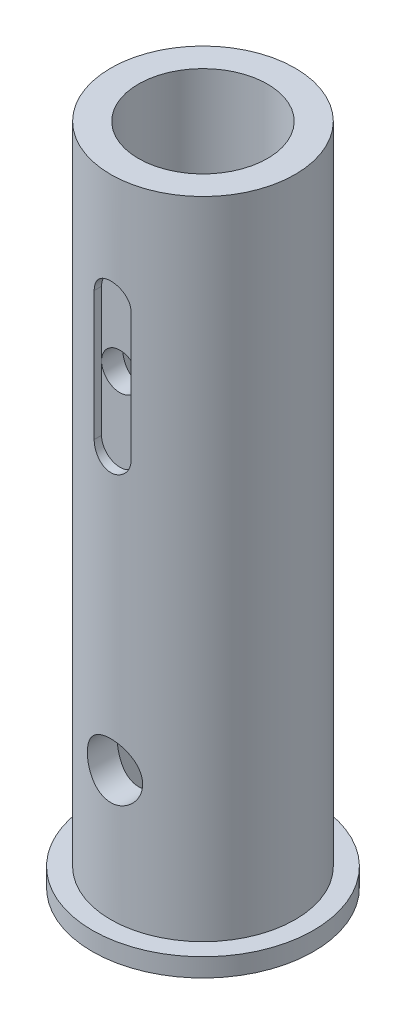
ISO-10303-21;
HEADER;
FILE_DESCRIPTION(('STEP AP214'),'2;1');
FILE_NAME('part.step','',(''),(''),'','','');
FILE_SCHEMA(('AUTOMOTIVE_DESIGN { 1 0 10303 214 1 1 1 1 }'));
ENDSEC;
DATA;
#1=APPLICATION_CONTEXT('core data for automotive mechanical design processes');
#2=APPLICATION_PROTOCOL_DEFINITION('international standard','automotive_design',2000,#1);
#3=PRODUCT_CONTEXT('',#1,'mechanical');
#4=PRODUCT('Part','Part','',(#3));
#5=PRODUCT_RELATED_PRODUCT_CATEGORY('part','',(#4));
#6=PRODUCT_DEFINITION_FORMATION('','',#4);
#7=PRODUCT_DEFINITION_CONTEXT('part definition',#1,'design');
#8=PRODUCT_DEFINITION('design','',#6,#7);
#9=PRODUCT_DEFINITION_SHAPE('','',#8);
#10=(LENGTH_UNIT() NAMED_UNIT(*) SI_UNIT(.MILLI.,.METRE.));
#11=(NAMED_UNIT(*) PLANE_ANGLE_UNIT() SI_UNIT($,.RADIAN.));
#12=(NAMED_UNIT(*) SI_UNIT($,.STERADIAN.) SOLID_ANGLE_UNIT());
#13=UNCERTAINTY_MEASURE_WITH_UNIT(LENGTH_MEASURE(1.E-05),#10,'distance_accuracy_value','');
#14=(GEOMETRIC_REPRESENTATION_CONTEXT(3) GLOBAL_UNCERTAINTY_ASSIGNED_CONTEXT((#13)) GLOBAL_UNIT_ASSIGNED_CONTEXT((#10,
#11,#12)) REPRESENTATION_CONTEXT('',''));
#15=CARTESIAN_POINT('',(0.,0.,0.));
#16=DIRECTION('',(0.,0.,1.));
#17=DIRECTION('',(1.,0.,0.));
#18=AXIS2_PLACEMENT_3D('',#15,#16,#17);
#19=CARTESIAN_POINT('',(0.,0.,9.));
#20=DIRECTION('',(0.,0.,1.));
#21=DIRECTION('',(1.,0.,0.));
#22=AXIS2_PLACEMENT_3D('',#19,#20,#21);
#23=PLANE('',#22);
#24=CARTESIAN_POINT('',(0.,51.,9.));
#25=DIRECTION('',(0.,0.,1.));
#26=DIRECTION('',(1.,0.,0.));
#27=AXIS2_PLACEMENT_3D('',#24,#25,#26);
#28=CIRCLE('',#27,2.);
#29=CARTESIAN_POINT('',(2.,51.,9.));
#30=VERTEX_POINT('',#29);
#31=CARTESIAN_POINT('',(-2.,51.,9.));
#32=VERTEX_POINT('',#31);
#33=EDGE_CURVE('E86',#30,#32,#28,.T.);
#34=ORIENTED_EDGE('',*,*,#33,.F.);
#35=DIRECTION('',(0.,1.,0.));
#36=VECTOR('',#35,1.);
#37=CARTESIAN_POINT('',(2.00000000000001,0.,9.));
#38=LINE('',#37,#36);
#39=CARTESIAN_POINT('',(2.,58.,9.));
#40=VERTEX_POINT('',#39);
#41=EDGE_CURVE('E126',#30,#40,#38,.T.);
#42=ORIENTED_EDGE('',*,*,#41,.T.);
#43=CARTESIAN_POINT('',(0.,58.,9.));
#44=DIRECTION('',(0.,0.,1.));
#45=DIRECTION('',(1.,0.,0.));
#46=AXIS2_PLACEMENT_3D('',#43,#44,#45);
#47=CIRCLE('',#46,2.);
#48=CARTESIAN_POINT('',(-2.00000000000001,58.,9.));
#49=VERTEX_POINT('',#48);
#50=EDGE_CURVE('E141',#40,#49,#47,.T.);
#51=ORIENTED_EDGE('',*,*,#50,.T.);
#52=DIRECTION('',(0.,1.,0.));
#53=VECTOR('',#52,1.);
#54=CARTESIAN_POINT('',(-1.99999999999999,0.,9.));
#55=LINE('',#54,#53);
#56=EDGE_CURVE('E94',#32,#49,#55,.T.);
#57=ORIENTED_EDGE('',*,*,#56,.F.);
#58=EDGE_LOOP('',(#34,#42,#51,#57));
#59=FACE_BOUND('',#58,.T.);
#60=ADVANCED_FACE('F65',(#59),#23,.T.);
#61=CARTESIAN_POINT('',(0.,-30.2842712474619,0.));
#62=DIRECTION('',(0.,1.,0.));
#63=DIRECTION('',(0.,0.,1.));
#64=AXIS2_PLACEMENT_3D('',#61,#62,#63);
#65=CYLINDRICAL_SURFACE('',#64,10.);
#66=CARTESIAN_POINT('',(0.,11.,10.));
#67=CARTESIAN_POINT('',(-0.1645772255066,11.0000019949698,9.999998585011));
#68=CARTESIAN_POINT('',(-0.329174636703059,11.0135877272479,9.99589831387907));
#69=CARTESIAN_POINT('',(-0.653576250609762,11.0674427084442,9.97994211187382));
#70=CARTESIAN_POINT('',(-0.81337900882284,11.1077199160467,9.96808386779384));
#71=CARTESIAN_POINT('',(-1.12346541550905,11.2134920338205,9.93791105003673));
#72=CARTESIAN_POINT('',(-1.27376272879074,11.2789497392379,9.91960600500851));
#73=CARTESIAN_POINT('',(-1.56124836210626,11.4330721861117,9.87844218475291));
#74=CARTESIAN_POINT('',(-1.69843493493934,11.5217400147908,9.85558280384133));
#75=CARTESIAN_POINT('',(-1.95974359436749,11.7224480149453,9.80701474385548));
#76=CARTESIAN_POINT('',(-2.08343614248868,11.8350332517718,9.78124767314073));
#77=CARTESIAN_POINT('',(-2.31049841846647,12.0792184598204,9.73011668420884));
#78=CARTESIAN_POINT('',(-2.41386472654882,12.2108216242499,9.70475283449003));
#79=CARTESIAN_POINT('',(-2.59960075447415,12.4929415060752,9.65668227987544));
#80=CARTESIAN_POINT('',(-2.68144618044427,12.6438169219815,9.63404813327749));
#81=CARTESIAN_POINT('',(-2.81842789549521,12.9579785084606,9.59487240788062));
#82=CARTESIAN_POINT('',(-2.87357059839947,13.121261687856,9.57832936626621));
#83=CARTESIAN_POINT('',(-2.95403267365303,13.4507805322609,9.55381741676868));
#84=CARTESIAN_POINT('',(-2.98014392469355,13.6168054877279,9.54562138649067));
#85=CARTESIAN_POINT('',(-3.00427461229344,13.9510663124335,9.53805579499534));
#86=CARTESIAN_POINT('',(-3.00230085522157,14.1193016361182,9.53868409521142));
#87=CARTESIAN_POINT('',(-2.97093954399623,14.446767817217,9.54849488135555));
#88=CARTESIAN_POINT('',(-2.9425441052537,14.6061045007245,9.55736777198281));
#89=CARTESIAN_POINT('',(-2.86074840854112,14.9176395725469,9.58216712457248));
#90=CARTESIAN_POINT('',(-2.80734568283282,15.0698372547487,9.59809428264701));
#91=CARTESIAN_POINT('',(-2.67632053307363,15.3652006993215,9.63545466149946));
#92=CARTESIAN_POINT('',(-2.59837633869285,15.5082141679105,9.65696032231904));
#93=CARTESIAN_POINT('',(-2.42070445177367,15.7794640440204,9.70301974000129));
#94=CARTESIAN_POINT('',(-2.32097148005177,15.9076968588276,9.72757423493982));
#95=CARTESIAN_POINT('',(-2.09762581531093,16.151372381524,9.77822022595875));
#96=CARTESIAN_POINT('',(-1.97318981493394,16.2660573280593,9.80433308620996));
#97=CARTESIAN_POINT('',(-1.70652651862793,16.4731079681285,9.85424488126517));
#98=CARTESIAN_POINT('',(-1.56429810372178,16.5654722568289,9.8780436703682));
#99=CARTESIAN_POINT('',(-1.26471007668561,16.7257198449295,9.92086320138941));
#100=CARTESIAN_POINT('',(-1.1072554994959,16.7934350324997,9.93985087336628));
#101=CARTESIAN_POINT('',(-0.782490831207039,16.9011991801993,9.97067043664444));
#102=CARTESIAN_POINT('',(-0.615183503179164,16.941255857065,9.98250432373999));
#103=CARTESIAN_POINT('',(-0.281904485336664,16.9913043557988,9.99736729287077));
#104=CARTESIAN_POINT('',(-0.116100195202374,17.0023231716032,10.0006970083558));
#105=CARTESIAN_POINT('',(0.214999211646766,16.9968616885758,9.99905846483519));
#106=CARTESIAN_POINT('',(0.380294393381561,16.9803850606971,9.99409131355514));
#107=CARTESIAN_POINT('',(0.701807210619393,16.921230777777,9.97661393974325));
#108=CARTESIAN_POINT('',(0.858145545228338,16.8791532248383,9.96427659598829));
#109=CARTESIAN_POINT('',(1.16150927790904,16.7707135344436,9.9334869568307));
#110=CARTESIAN_POINT('',(1.30853355405117,16.7043484779243,9.91503392642188));
#111=CARTESIAN_POINT('',(1.5928743789221,16.5474936690377,9.87339308702631));
#112=CARTESIAN_POINT('',(1.72988765239934,16.456481318104,9.8501056165928));
#113=CARTESIAN_POINT('',(1.9870466159603,16.2535504918944,9.80146937528705));
#114=CARTESIAN_POINT('',(2.10718806471188,16.1416267762247,9.7761200886242));
#115=CARTESIAN_POINT('',(2.33171489102052,15.8952253832613,9.72506343738007));
#116=CARTESIAN_POINT('',(2.43536962463001,15.7600762484564,9.69937650065513));
#117=CARTESIAN_POINT('',(2.61857990144313,15.4737441219731,9.65153030477949));
#118=CARTESIAN_POINT('',(2.69813607658965,15.3225615508843,9.62937095313121));
#119=CARTESIAN_POINT('',(2.83034694254316,15.00893501749,9.5913437922631));
#120=CARTESIAN_POINT('',(2.88312693874021,14.8465476269243,9.57544675673501));
#121=CARTESIAN_POINT('',(2.96043461630306,14.5146240621395,9.55183188739737));
#122=CARTESIAN_POINT('',(2.98497197957849,14.3450903584339,9.54411125069387));
#123=CARTESIAN_POINT('',(3.0044396896993,14.0112769632232,9.53799944941558));
#124=CARTESIAN_POINT('',(3.00056110615887,13.8470726979012,9.53923294700394));
#125=CARTESIAN_POINT('',(2.9661501088861,13.5217717931988,9.54998802392188));
#126=CARTESIAN_POINT('',(2.93561876249408,13.360675029639,9.55950927135902));
#127=CARTESIAN_POINT('',(2.84953777608686,13.0481092017367,9.58551527389243));
#128=CARTESIAN_POINT('',(2.79430351014248,12.8965454252826,9.60191209104934));
#129=CARTESIAN_POINT('',(2.66063014242147,12.6047151223586,9.63980557805265));
#130=CARTESIAN_POINT('',(2.58218659925722,12.4644507647169,9.6613032238508));
#131=CARTESIAN_POINT('',(2.40097527610175,12.1936737669475,9.70795352855338));
#132=CARTESIAN_POINT('',(2.29742552185996,12.0637024774796,9.7332108032858));
#133=CARTESIAN_POINT('',(2.07034869259555,11.8225950033838,9.78402640899066));
#134=CARTESIAN_POINT('',(1.94681643426898,11.7114637210644,9.80958481647543));
#135=CARTESIAN_POINT('',(1.67893152436652,11.5079531754101,9.85901873141573));
#136=CARTESIAN_POINT('',(1.53407577158122,11.4162171062891,9.88282319531422));
#137=CARTESIAN_POINT('',(1.23028274796705,11.2585296601919,9.92521360911553));
#138=CARTESIAN_POINT('',(1.07135210599791,11.192566223451,9.94380199862114));
#139=CARTESIAN_POINT('',(0.761515425310563,11.0942094486945,9.97204349938619));
#140=CARTESIAN_POINT('',(0.611573923908467,11.0589766542335,9.9824405476214));
#141=CARTESIAN_POINT('',(0.307760390461557,11.0118729495169,9.9964188898898));
#142=CARTESIAN_POINT('',(0.153889019716279,10.9999981345904,10.0000013230948));
#143=CARTESIAN_POINT('',(0.,11.,10.));
#144=B_SPLINE_CURVE_WITH_KNOTS('',3,(#66,#67,#68,#69,#70,#71,#72,#73,#74,#75,#76,#77,#78,#79,
#80,#81,#82,#83,#84,#85,#86,#87,#88,#89,#90,#91,#92,#93,#94,#95,#96,#97,#98,#99,#100,#101,#102,
#103,#104,#105,#106,#107,#108,#109,#110,#111,#112,#113,#114,#115,#116,#117,#118,#119,#120,#121,
#122,#123,#124,#125,#126,#127,#128,#129,#130,#131,#132,#133,#134,#135,#136,#137,#138,#139,#140,
#141,#142,#143),.UNSPECIFIED.,.T.,.F.,(4,2,2,2,2,2,2,2,2,2,2,2,2,2,2,2,2,2,2,2,2,2,2,2,2,2,2,2,
2,2,2,2,2,2,2,2,2,2,4),(0.,0.493166407225221,0.986479929691998,1.47906735260175,1.9717203288254,
2.47711205896383,2.98258874577266,3.49942962008218,4.01614629086447,4.51839378713198,
5.02051956638178,5.50452033395353,5.98856887316003,6.47924852894239,6.97004720317111,
7.48134208096333,7.99266913062143,8.50742093763377,9.02202907057615,9.5181761887709,
10.0142570710065,10.4991349336465,10.9840710918746,11.4802261140582,11.9765056400038,
12.4908080064564,13.0050968850536,13.516956299025,14.0286401892057,14.5190031093854,
15.0093463933232,15.4936008081456,15.9779479511534,16.4799385136898,16.9820594980413,
17.4988599232246,18.0154182319959,18.4766338387004,18.9377723390687),.UNSPECIFIED.);
#145=CARTESIAN_POINT('',(0.,11.,10.));
#146=VERTEX_POINT('',#145);
#147=EDGE_CURVE('E208',#146,#146,#144,.T.);
#148=ORIENTED_EDGE('',*,*,#147,.T.);
#149=EDGE_LOOP('',(#148));
#150=FACE_BOUND('',#149,.T.);
#151=CARTESIAN_POINT('',(0.,0.,0.));
#152=DIRECTION('',(0.,1.,0.));
#153=DIRECTION('',(0.,0.,1.));
#154=AXIS2_PLACEMENT_3D('',#151,#152,#153);
#155=CIRCLE('',#154,10.);
#156=CARTESIAN_POINT('',(0.,0.,10.));
#157=VERTEX_POINT('',#156);
#158=EDGE_CURVE('E223',#157,#157,#155,.T.);
#159=ORIENTED_EDGE('',*,*,#158,.T.);
#160=EDGE_LOOP('',(#159));
#161=FACE_BOUND('',#160,.T.);
#162=CARTESIAN_POINT('',(0.,70.,0.));
#163=DIRECTION('',(0.,1.,0.));
#164=DIRECTION('',(0.,0.,1.));
#165=AXIS2_PLACEMENT_3D('',#162,#163,#164);
#166=CIRCLE('',#165,10.);
#167=CARTESIAN_POINT('',(0.,70.,10.));
#168=VERTEX_POINT('',#167);
#169=EDGE_CURVE('E218',#168,#168,#166,.T.);
#170=ORIENTED_EDGE('',*,*,#169,.F.);
#171=EDGE_LOOP('',(#170));
#172=FACE_BOUND('',#171,.T.);
#173=CARTESIAN_POINT('',(-2.00000000000001,58.,9.79795897113271));
#174=CARTESIAN_POINT('',(-2.00000029709047,58.0556671372987,9.79795611157838));
#175=CARTESIAN_POINT('',(-1.99767440405642,58.1113070388049,9.79843398465431));
#176=CARTESIAN_POINT('',(-1.98839986829158,58.2221774356675,9.80032138150132));
#177=CARTESIAN_POINT('',(-1.98145179742019,58.2774079808152,9.80173079002197));
#178=CARTESIAN_POINT('',(-1.95376239954904,58.4417098803016,9.8073028328515));
#179=CARTESIAN_POINT('',(-1.92617555297559,58.5496628575345,9.81280956758554));
#180=CARTESIAN_POINT('',(-1.85359362042639,58.7592851934839,9.8267766040168));
#181=CARTESIAN_POINT('',(-1.80859661275257,58.8609538571135,9.83523723174864));
#182=CARTESIAN_POINT('',(-1.70250820881971,59.0553297677597,9.85415440257657));
#183=CARTESIAN_POINT('',(-1.64141514447462,59.1480360846177,9.86461115250626));
#184=CARTESIAN_POINT('',(-1.50396101869286,59.3231196733701,9.88650550448304));
#185=CARTESIAN_POINT('',(-1.42741780364327,59.4053525644588,9.89795377776164));
#186=CARTESIAN_POINT('',(-1.2616211819837,59.5559088785751,9.92044851228358));
#187=CARTESIAN_POINT('',(-1.17236580968336,59.624230146461,9.93149491105252));
#188=CARTESIAN_POINT('',(-0.982720106800593,59.7455778018475,9.95205620855081));
#189=CARTESIAN_POINT('',(-0.882239649549987,59.7984659384246,9.96155694564014));
#190=CARTESIAN_POINT('',(-0.673602404217799,59.8865517690996,9.97783510908995));
#191=CARTESIAN_POINT('',(-0.56544675429783,59.9217520799118,9.9846129382442));
#192=CARTESIAN_POINT('',(-0.346034817774205,59.9730140969379,9.99460635553984));
#193=CARTESIAN_POINT('',(-0.234838069151997,59.9893215789678,9.99786765043076));
#194=CARTESIAN_POINT('',(-0.011239753498265,60.0031019588768,10.0006184349224));
#195=CARTESIAN_POINT('',(0.101161724783845,60.0005762347569,10.000108200481));
#196=CARTESIAN_POINT('',(0.322284405513383,59.9769475992568,9.99540868887644));
#197=CARTESIAN_POINT('',(0.431035226714458,59.9561099001905,9.9912719366342));
#198=CARTESIAN_POINT('',(0.643464013108166,59.8968696460479,9.97984349003516));
#199=CARTESIAN_POINT('',(0.747141812282545,59.8584665165555,9.97255169250401));
#200=CARTESIAN_POINT('',(0.947240542625917,59.7649391930093,9.95554578241051));
#201=CARTESIAN_POINT('',(1.04361145363294,59.7097108261481,9.94581664782192));
#202=CARTESIAN_POINT('',(1.22581287576612,59.5841794594466,9.92500903258345));
#203=CARTESIAN_POINT('',(1.31164251244036,59.5138752103125,9.91393044014086));
#204=CARTESIAN_POINT('',(1.47189241307715,59.3587432767496,9.8914207473701));
#205=CARTESIAN_POINT('',(1.54608938999208,59.2736851958569,9.8799868648348));
#206=CARTESIAN_POINT('',(1.67922179979889,59.0921904830222,9.85823412232848));
#207=CARTESIAN_POINT('',(1.73815300484306,58.9957507096675,9.84791557170815));
#208=CARTESIAN_POINT('',(1.83915990928954,58.7938951901082,9.82955460084642));
#209=CARTESIAN_POINT('',(1.881189753269,58.6884559532069,9.8215183899669));
#210=CARTESIAN_POINT('',(1.94681419465982,58.4718827374886,9.80872322124987));
#211=CARTESIAN_POINT('',(1.97043625496866,58.3607575067037,9.80395938256574));
#212=CARTESIAN_POINT('',(1.98966587624393,58.2072863663071,9.80006354383926));
#213=CARTESIAN_POINT('',(1.99354251131102,58.1658917204351,9.79927519743986));
#214=CARTESIAN_POINT('',(1.9987063293293,58.0830042717252,9.79822334773544));
#215=CARTESIAN_POINT('',(1.99999784580931,58.0415117500884,9.79795896609649));
#216=CARTESIAN_POINT('',(2.,58.,9.79795897113271));
#217=B_SPLINE_CURVE_WITH_KNOTS('',3,(#173,#174,#175,#176,#177,#178,#179,#180,#181,#182,#183,
#184,#185,#186,#187,#188,#189,#190,#191,#192,#193,#194,#195,#196,#197,#198,#199,#200,#201,#202,
#203,#204,#205,#206,#207,#208,#209,#210,#211,#212,#213,#214,#215,#216),.UNSPECIFIED.,.F.,.F.,(4,
2,2,2,2,2,2,2,2,2,2,2,2,2,2,2,2,2,2,2,2,4),(0.,0.166897020715845,0.33377339664307,
0.666722601037227,0.999708566174145,1.33272905329864,1.66993288931439,2.00718892413592,
2.34737937755194,2.68751948879679,3.02318320738908,3.35882236614863,3.68967912555438,
4.02054670525121,4.35350597112352,4.68649283901808,5.02524540329293,5.3640916848566,
5.70385119298728,6.04310283225106,6.16778801087552,6.29226399953899),.UNSPECIFIED.);
#218=CARTESIAN_POINT('',(-2.00000000000001,58.,9.79795897113272));
#219=VERTEX_POINT('',#218);
#220=CARTESIAN_POINT('',(2.,58.,9.79795897113271));
#221=VERTEX_POINT('',#220);
#222=EDGE_CURVE('E169',#219,#221,#217,.T.);
#223=ORIENTED_EDGE('',*,*,#222,.T.);
#224=DIRECTION('',(0.,1.,0.));
#225=VECTOR('',#224,1.);
#226=CARTESIAN_POINT('',(2.00000000000002,-30.2842712474619,9.79795897113271));
#227=LINE('',#226,#225);
#228=CARTESIAN_POINT('',(2.,44.,9.79795897113271));
#229=VERTEX_POINT('',#228);
#230=EDGE_CURVE('E158',#221,#229,#227,.F.);
#231=ORIENTED_EDGE('',*,*,#230,.T.);
#232=CARTESIAN_POINT('',(2.,44.,9.79795897113271));
#233=CARTESIAN_POINT('',(2.00000029709046,43.9443328627013,9.79795611157838));
#234=CARTESIAN_POINT('',(1.99767440405642,43.8886929611951,9.79843398465431));
#235=CARTESIAN_POINT('',(1.98839986829158,43.7778225643325,9.80032138150132));
#236=CARTESIAN_POINT('',(1.98145179742019,43.7225920191848,9.80173079002197));
#237=CARTESIAN_POINT('',(1.95376239954904,43.5582901196984,9.8073028328515));
#238=CARTESIAN_POINT('',(1.92617555297558,43.4503371424655,9.81280956758554));
#239=CARTESIAN_POINT('',(1.85359362042639,43.2407148065161,9.8267766040168));
#240=CARTESIAN_POINT('',(1.80859661275257,43.1390461428865,9.83523723174864));
#241=CARTESIAN_POINT('',(1.7025082088197,42.9446702322403,9.85415440257657));
#242=CARTESIAN_POINT('',(1.64141514447461,42.8519639153823,9.86461115250626));
#243=CARTESIAN_POINT('',(1.50396101869285,42.6768803266299,9.88650550448304));
#244=CARTESIAN_POINT('',(1.42741780364326,42.5946474355412,9.89795377776164));
#245=CARTESIAN_POINT('',(1.26162118198369,42.4440911214249,9.92044851228358));
#246=CARTESIAN_POINT('',(1.17236580968336,42.375769853539,9.93149491105252));
#247=CARTESIAN_POINT('',(0.98272010680059,42.2544221981525,9.95205620855081));
#248=CARTESIAN_POINT('',(0.882239649549985,42.2015340615754,9.96155694564014));
#249=CARTESIAN_POINT('',(0.673602404217796,42.1134482309005,9.97783510908995));
#250=CARTESIAN_POINT('',(0.565446754297827,42.0782479200882,9.9846129382442));
#251=CARTESIAN_POINT('',(0.346034817774203,42.0269859030621,9.99460635553984));
#252=CARTESIAN_POINT('',(0.234838069151994,42.0106784210322,9.99786765043076));
#253=CARTESIAN_POINT('',(0.0112397534982624,41.9968980411232,10.0006184349224));
#254=CARTESIAN_POINT('',(-0.101161724783847,41.9994237652431,10.000108200481));
#255=CARTESIAN_POINT('',(-0.322284405513386,42.0230524007432,9.99540868887644));
#256=CARTESIAN_POINT('',(-0.431035226714462,42.0438900998095,9.9912719366342));
#257=CARTESIAN_POINT('',(-0.64346401310817,42.1031303539521,9.97984349003516));
#258=CARTESIAN_POINT('',(-0.747141812282548,42.1415334834445,9.97255169250401));
#259=CARTESIAN_POINT('',(-0.947240542625919,42.2350608069907,9.95554578241051));
#260=CARTESIAN_POINT('',(-1.04361145363294,42.2902891738519,9.94581664782193));
#261=CARTESIAN_POINT('',(-1.22581287576612,42.4158205405534,9.92500903258345));
#262=CARTESIAN_POINT('',(-1.31164251244036,42.4861247896875,9.91393044014086));
#263=CARTESIAN_POINT('',(-1.47189241307715,42.6412567232505,9.8914207473701));
#264=CARTESIAN_POINT('',(-1.54608938999209,42.7263148041431,9.8799868648348));
#265=CARTESIAN_POINT('',(-1.6792217997989,42.9078095169778,9.85823412232847));
#266=CARTESIAN_POINT('',(-1.73815300484306,43.0042492903325,9.84791557170815));
#267=CARTESIAN_POINT('',(-1.83915990928954,43.2061048098918,9.82955460084642));
#268=CARTESIAN_POINT('',(-1.881189753269,43.3115440467932,9.8215183899669));
#269=CARTESIAN_POINT('',(-1.94681419465983,43.5281172625114,9.80872322124987));
#270=CARTESIAN_POINT('',(-1.97043625496866,43.6392424932963,9.80395938256574));
#271=CARTESIAN_POINT('',(-1.98966587624394,43.7927136336929,9.80006354383926));
#272=CARTESIAN_POINT('',(-1.99354251131102,43.8341082795649,9.79927519743986));
#273=CARTESIAN_POINT('',(-1.9987063293293,43.9169957282749,9.79822334773544));
#274=CARTESIAN_POINT('',(-1.99999784580931,43.9584882499116,9.79795896609649));
#275=CARTESIAN_POINT('',(-2.,44.,9.79795897113271));
#276=B_SPLINE_CURVE_WITH_KNOTS('',3,(#232,#233,#234,#235,#236,#237,#238,#239,#240,#241,#242,
#243,#244,#245,#246,#247,#248,#249,#250,#251,#252,#253,#254,#255,#256,#257,#258,#259,#260,#261,
#262,#263,#264,#265,#266,#267,#268,#269,#270,#271,#272,#273,#274,#275),.UNSPECIFIED.,.F.,.F.,(4,
2,2,2,2,2,2,2,2,2,2,2,2,2,2,2,2,2,2,2,2,4),(0.,0.166897020715838,0.33377339664307,
0.666722601037227,0.999708566174145,1.33272905329864,1.66993288931439,2.00718892413592,
2.34737937755194,2.68751948879679,3.02318320738907,3.35882236614863,3.68967912555438,
4.02054670525121,4.35350597112352,4.68649283901808,5.02524540329293,5.3640916848566,
5.70385119298728,6.04310283225106,6.16778801087553,6.29226399953898),.UNSPECIFIED.);
#277=CARTESIAN_POINT('',(-2.,44.,9.79795897113271));
#278=VERTEX_POINT('',#277);
#279=EDGE_CURVE('E160',#229,#278,#276,.T.);
#280=ORIENTED_EDGE('',*,*,#279,.T.);
#281=DIRECTION('',(0.,1.,0.));
#282=VECTOR('',#281,1.);
#283=CARTESIAN_POINT('',(-1.99999999999999,-30.2842712474619,9.79795897113272));
#284=LINE('',#283,#282);
#285=EDGE_CURVE('E156',#219,#278,#284,.F.);
#286=ORIENTED_EDGE('',*,*,#285,.F.);
#287=EDGE_LOOP('',(#223,#231,#280,#286));
#288=FACE_BOUND('',#287,.T.);
#289=ADVANCED_FACE('F176',(#150,#161,#172,#288),#65,.T.);
#290=CARTESIAN_POINT('',(0.,-2.,0.));
#291=DIRECTION('',(0.,1.,0.));
#292=DIRECTION('',(0.,0.,1.));
#293=AXIS2_PLACEMENT_3D('',#290,#291,#292);
#294=CYLINDRICAL_SURFACE('',#293,7.);
#295=CARTESIAN_POINT('',(0.,49.,7.));
#296=CARTESIAN_POINT('',(0.109954902377251,49.0000019395619,6.99999869294341));
#297=CARTESIAN_POINT('',(0.219929747872581,49.0090977889761,6.99738417402043));
#298=CARTESIAN_POINT('',(0.436691991196988,49.0451642701023,6.98720905945103));
#299=CARTESIAN_POINT('',(0.543478166829615,49.0721416660741,6.97964659210084));
#300=CARTESIAN_POINT('',(0.750704300737872,49.1430080384165,6.96040691349073));
#301=CARTESIAN_POINT('',(0.851152880848227,49.1868734361519,6.94873544106341));
#302=CARTESIAN_POINT('',(1.04326876112927,49.2901779914784,6.92249978316544));
#303=CARTESIAN_POINT('',(1.13493514117817,49.3496187784904,6.90793529508022));
#304=CARTESIAN_POINT('',(1.30929444685895,49.4840350106729,6.8770473462558));
#305=CARTESIAN_POINT('',(1.39172372238095,49.5593447538553,6.8606904194519));
#306=CARTESIAN_POINT('',(1.54297135792436,49.7226477431377,6.82826734915641));
#307=CARTESIAN_POINT('',(1.61178767707783,49.8106428876322,6.81220124959343));
#308=CARTESIAN_POINT('',(1.73519790006431,49.9989935827909,6.78183014875388));
#309=CARTESIAN_POINT('',(1.78947821103349,50.0995619850649,6.76756702506017));
#310=CARTESIAN_POINT('',(1.88025170553981,50.3088720117508,6.74291343840667));
#311=CARTESIAN_POINT('',(1.91674871555719,50.4176118720709,6.73252214244871));
#312=CARTESIAN_POINT('',(1.96998433013875,50.6372347631655,6.71713608196016));
#313=CARTESIAN_POINT('',(1.9872055320285,50.7479913627678,6.71200978570011));
#314=CARTESIAN_POINT('',(2.00290667789185,50.9709311484461,6.70734208201995));
#315=CARTESIAN_POINT('',(2.00139069409621,51.0831140192502,6.70779946107611));
#316=CARTESIAN_POINT('',(1.98004134762903,51.3018686114562,6.71413034409934));
#317=CARTESIAN_POINT('',(1.96080325728392,51.4085043511808,6.71982782697936));
#318=CARTESIAN_POINT('',(1.9055138608579,51.6169672196276,6.7357134838281));
#319=CARTESIAN_POINT('',(1.8694610348125,51.7187939127205,6.74590206376403));
#320=CARTESIAN_POINT('',(1.78110681137812,51.9162462444318,6.7697686351608));
#321=CARTESIAN_POINT('',(1.72860551172881,52.0117770724017,6.78348916405649));
#322=CARTESIAN_POINT('',(1.60898379167885,52.1928765612134,6.81285216882059));
#323=CARTESIAN_POINT('',(1.54186011673345,52.2784429977349,6.82849507221912));
#324=CARTESIAN_POINT('',(1.39190399673021,52.4405723756064,6.86066250656356));
#325=CARTESIAN_POINT('',(1.30857487484533,52.5166744759672,6.87719804572366));
#326=CARTESIAN_POINT('',(1.13013228238623,52.6539260036403,6.90876247218345));
#327=CARTESIAN_POINT('',(1.03501820148189,52.7150746560417,6.92379128137825));
#328=CARTESIAN_POINT('',(0.834923073091447,52.820928734774,6.95076528065502));
#329=CARTESIAN_POINT('',(0.729889817810006,52.8655402868042,6.96269275497229));
#330=CARTESIAN_POINT('',(0.513393229967469,52.9363338914168,6.98199251487585));
#331=CARTESIAN_POINT('',(0.401931525810145,52.9625205892453,6.98936594856255));
#332=CARTESIAN_POINT('',(0.179666388644348,52.9949732857095,6.99854874514672));
#333=CARTESIAN_POINT('',(0.0689613468605068,53.001864695373,7.00053272850599));
#334=CARTESIAN_POINT('',(-0.152026526805584,52.997272733699,6.99922084707091));
#335=CARTESIAN_POINT('',(-0.262309407757108,52.9857915671541,6.99592561580629));
#336=CARTESIAN_POINT('',(-0.477018633430315,52.9452895556838,6.98453926685206));
#337=CARTESIAN_POINT('',(-0.581518211734844,52.9166268186766,6.97654613017679));
#338=CARTESIAN_POINT('',(-0.784208686205642,52.8429994980153,6.95667998741883));
#339=CARTESIAN_POINT('',(-0.882398851248718,52.7980330291107,6.94480653265874));
#340=CARTESIAN_POINT('',(-1.07204168512003,52.6919766633549,6.91809961169145));
#341=CARTESIAN_POINT('',(-1.16330248654009,52.6305588011747,6.9032076317834));
#342=CARTESIAN_POINT('',(-1.33443852805947,52.4937474940489,6.87217947098441));
#343=CARTESIAN_POINT('',(-1.41431117084304,52.4183508699354,6.85604300755107));
#344=CARTESIAN_POINT('',(-1.56310642834007,52.2527906579506,6.82368619629443));
#345=CARTESIAN_POINT('',(-1.63158542740713,52.162224724441,6.80748036858305));
#346=CARTESIAN_POINT('',(-1.75239531606757,51.9705374113753,6.77738894734787));
#347=CARTESIAN_POINT('',(-1.8047267674867,51.8694163992287,6.76350327310608));
#348=CARTESIAN_POINT('',(-1.89137454118279,51.6599087890248,6.73978651242835));
#349=CARTESIAN_POINT('',(-1.92578633239654,51.5515642365024,6.72993400029434));
#350=CARTESIAN_POINT('',(-1.9757945006787,51.3302900644252,6.71542456669526));
#351=CARTESIAN_POINT('',(-1.99139657901587,51.2173618449236,6.71076607094366));
#352=CARTESIAN_POINT('',(-2.00298024246851,50.9947039670632,6.70731703127619));
#353=CARTESIAN_POINT('',(-1.99968027644405,50.8850144954434,6.70831160808103));
#354=CARTESIAN_POINT('',(-1.97524710957467,50.6678252693383,6.71554597206102));
#355=CARTESIAN_POINT('',(-1.95411450379874,50.5603254419081,6.72178558421113));
#356=CARTESIAN_POINT('',(-1.89505968816675,50.3516216288314,6.73866977160527));
#357=CARTESIAN_POINT('',(-1.85731091786365,50.2503646129888,6.74926877048974));
#358=CARTESIAN_POINT('',(-1.76622949301581,50.0555412655078,6.77367302842112));
#359=CARTESIAN_POINT('',(-1.71289408043152,49.9619762987268,6.78747885482392));
#360=CARTESIAN_POINT('',(-1.59006546534829,49.7818164781947,6.81731668949934));
#361=CARTESIAN_POINT('',(-1.52009227722732,49.695558608658,6.83340763179064));
#362=CARTESIAN_POINT('',(-1.36685984037935,49.5357761041902,6.86569845092232));
#363=CARTESIAN_POINT('',(-1.28359725072856,49.4622546808892,6.88189835417168));
#364=CARTESIAN_POINT('',(-1.10357432086539,49.3281628156734,6.91307959572365));
#365=CARTESIAN_POINT('',(-1.00652250235978,49.2679730127304,6.92801901037413));
#366=CARTESIAN_POINT('',(-0.803250529646662,49.164854214978,6.95451395777971));
#367=CARTESIAN_POINT('',(-0.69703542411474,49.1219157880669,6.96607133870287));
#368=CARTESIAN_POINT('',(-0.492916315335036,49.0591524486046,6.98327344725308));
#369=CARTESIAN_POINT('',(-0.395763007624392,49.0370264633154,6.98949684362076));
#370=CARTESIAN_POINT('',(-0.199078368786369,49.0074503427579,6.99786043852147));
#371=CARTESIAN_POINT('',(-0.0995473576160926,48.9999982440231,7.00000118333996));
#372=CARTESIAN_POINT('',(0.,49.,7.));
#373=B_SPLINE_CURVE_WITH_KNOTS('',3,(#295,#296,#297,#298,#299,#300,#301,#302,#303,#304,#305,
#306,#307,#308,#309,#310,#311,#312,#313,#314,#315,#316,#317,#318,#319,#320,#321,#322,#323,#324,
#325,#326,#327,#328,#329,#330,#331,#332,#333,#334,#335,#336,#337,#338,#339,#340,#341,#342,#343,
#344,#345,#346,#347,#348,#349,#350,#351,#352,#353,#354,#355,#356,#357,#358,#359,#360,#361,#362,
#363,#364,#365,#366,#367,#368,#369,#370,#371,#372),.UNSPECIFIED.,.T.,.F.,(4,2,2,2,2,2,2,2,2,2,2,
2,2,2,2,2,2,2,2,2,2,2,2,2,2,2,2,2,2,2,2,2,2,2,2,2,2,2,4),(0.,0.329499312542343,
0.659123339795181,0.988288812895347,1.31748873543516,1.65447811530783,1.99151797873714,
2.33533075300058,2.6790695154481,3.0139950986275,3.34884789231233,3.67284785829333,
3.99687711786126,4.32500803291211,4.65321205577344,4.99378500602502,5.33437560155449,
5.67687101104449,6.01928004014613,6.35045457698201,6.68158937434649,7.0060514047952,
7.3305509657553,7.66207525344452,7.99367503187788,8.33612104884334,8.67855514965299,
9.01914573366139,9.35963305787734,9.68726681616471,10.0148896418598,10.3391709629126,
10.6635096999758,10.9986765689036,11.3339278310847,11.6777797897016,12.0214434923409,
12.3197946803795,12.6181059442772),.UNSPECIFIED.);
#374=CARTESIAN_POINT('',(0.,49.,7.));
#375=VERTEX_POINT('',#374);
#376=EDGE_CURVE('E69',#375,#375,#373,.T.);
#377=ORIENTED_EDGE('',*,*,#376,.T.);
#378=EDGE_LOOP('',(#377));
#379=FACE_BOUND('',#378,.T.);
#380=CARTESIAN_POINT('',(0.,11.,7.));
#381=CARTESIAN_POINT('',(-0.160281740269092,11.0000074695815,6.9999940839629));
#382=CARTESIAN_POINT('',(-0.32083390752243,11.0129213160966,6.99443250051265));
#383=CARTESIAN_POINT('',(-0.637349314958985,11.0640823654265,6.97273920628719));
#384=CARTESIAN_POINT('',(-0.793299928144206,11.1023935290734,6.95658080950724));
#385=CARTESIAN_POINT('',(-1.09553470514829,11.2026697636251,6.91541630739346));
#386=CARTESIAN_POINT('',(-1.24185033642246,11.2645528438054,6.89044089228941));
#387=CARTESIAN_POINT('',(-1.5218733278968,11.4098644185637,6.83405660276648));
#388=CARTESIAN_POINT('',(-1.6555840905338,11.4932870760918,6.80264947176647));
#389=CARTESIAN_POINT('',(-1.91384144205638,11.6839276476879,6.7346782187555));
#390=CARTESIAN_POINT('',(-2.03764045493602,11.7920952598958,6.69793895962371));
#391=CARTESIAN_POINT('',(-2.26599040232609,12.0271438685008,6.62417654338771));
#392=CARTESIAN_POINT('',(-2.3705306503261,12.1540351846027,6.5871532404671));
#393=CARTESIAN_POINT('',(-2.56285686126492,12.4310327227155,6.51482055271223));
#394=CARTESIAN_POINT('',(-2.64946811752636,12.5820104580293,6.47970460244924));
#395=CARTESIAN_POINT('',(-2.79573199408101,12.898109428189,6.41796168635027));
#396=CARTESIAN_POINT('',(-2.8553992914263,13.0632229044862,6.39133010120133));
#397=CARTESIAN_POINT('',(-2.94294919918374,13.3943007383092,6.35147799087276));
#398=CARTESIAN_POINT('',(-2.97227494401776,13.5598077017795,6.3376522143554));
#399=CARTESIAN_POINT('',(-3.00280607158394,13.8939259696104,6.32324849688131));
#400=CARTESIAN_POINT('',(-3.00402828615096,14.0625353552914,6.32266262625149));
#401=CARTESIAN_POINT('',(-2.97939999510613,14.3832999037186,6.33429573902539));
#402=CARTESIAN_POINT('',(-2.95576113815072,14.535670623332,6.34546870930158));
#403=CARTESIAN_POINT('',(-2.88580772808799,14.8340275859013,6.37758411517576));
#404=CARTESIAN_POINT('',(-2.83948852833539,14.9800125138861,6.39852855266591));
#405=CARTESIAN_POINT('',(-2.7245765907069,15.2652471514352,6.44830685655465));
#406=CARTESIAN_POINT('',(-2.65551974428426,15.4042802942182,6.47730295111391));
#407=CARTESIAN_POINT('',(-2.49742304873013,15.6693463240694,6.53988493882129));
#408=CARTESIAN_POINT('',(-2.40837507480489,15.7953738949295,6.57347269593628));
#409=CARTESIAN_POINT('',(-2.20343405392229,16.0427775036214,6.64512404535213));
#410=CARTESIAN_POINT('',(-2.08584728856133,16.162716729472,6.68331855389209));
#411=CARTESIAN_POINT('',(-1.83187332405076,16.381671590656,6.75734605758523));
#412=CARTESIAN_POINT('',(-1.6954812162799,16.4806817458782,6.79317843254652));
#413=CARTESIAN_POINT('',(-1.40318582301271,16.657243932807,6.8595969368957));
#414=CARTESIAN_POINT('',(-1.24687114970231,16.7341790187056,6.89002455033727));
#415=CARTESIAN_POINT('',(-0.921879694158933,16.8601502376147,6.94097396260558));
#416=CARTESIAN_POINT('',(-0.753210215657664,16.9092027059777,6.96150156039981));
#417=CARTESIAN_POINT('',(-0.420276238941369,16.974933860459,6.98923526893385));
#418=CARTESIAN_POINT('',(-0.256457961010923,16.9935387653144,6.99723249964589));
#419=CARTESIAN_POINT('',(0.0721433011185079,17.0036295764082,7.00155416651738));
#420=CARTESIAN_POINT('',(0.236925971900557,16.9951238525324,6.99788220531666));
#421=CARTESIAN_POINT('',(0.553542439626672,16.9525843679452,6.9797867632015));
#422=CARTESIAN_POINT('',(0.705598931504218,16.9199316785517,6.96594519473644));
#423=CARTESIAN_POINT('',(1.00189113639242,16.8319791057618,6.92953888009974));
#424=CARTESIAN_POINT('',(1.14612587370002,16.7766764042778,6.90697304848521));
#425=CARTESIAN_POINT('',(1.42777696523888,16.6431988404979,6.8543875151372));
#426=CARTESIAN_POINT('',(1.56483974951837,16.5643636697739,6.82415705388474));
#427=CARTESIAN_POINT('',(1.82428490564705,16.3867810555241,6.75942988391438));
#428=CARTESIAN_POINT('',(1.94666097512992,16.2880251119767,6.72493135648758));
#429=CARTESIAN_POINT('',(2.18296759532595,16.0647104121571,6.65214788697903));
#430=CARTESIAN_POINT('',(2.29556617553686,15.9387677899386,6.61377354998591));
#431=CARTESIAN_POINT('',(2.49843431443676,15.6692177013684,6.53984037690252));
#432=CARTESIAN_POINT('',(2.58869766421195,15.5256053396252,6.50428232556792));
#433=CARTESIAN_POINT('',(2.74563875632303,15.2211861470414,6.43962969285319));
#434=CARTESIAN_POINT('',(2.81186415020233,15.06011699095,6.41066255987443));
#435=CARTESIAN_POINT('',(2.91565885028324,14.7274736732605,6.36413607530145));
#436=CARTESIAN_POINT('',(2.95325364225748,14.5559090016754,6.346566580073));
#437=CARTESIAN_POINT('',(2.9961194841997,14.2220088276671,6.32643481136621));
#438=CARTESIAN_POINT('',(3.00374693238451,14.0600407324894,6.3227792566546));
#439=CARTESIAN_POINT('',(2.99282649265778,13.7372102530885,6.32795618271386));
#440=CARTESIAN_POINT('',(2.97428322126543,13.5763476788807,6.33678646098226));
#441=CARTESIAN_POINT('',(2.91356431394149,13.2689583037266,6.3649165389077));
#442=CARTESIAN_POINT('',(2.87266975661121,13.1221212084293,6.38364713099396));
#443=CARTESIAN_POINT('',(2.769702223632,12.8373792339161,6.42898875831973));
#444=CARTESIAN_POINT('',(2.70762322652258,12.6994769075923,6.45560203384715));
#445=CARTESIAN_POINT('',(2.55963250501149,12.4271792913205,6.5157524732596));
#446=CARTESIAN_POINT('',(2.47248232196069,12.2935308463052,6.5496164957701));
#447=CARTESIAN_POINT('',(2.2784960092513,12.0420176387525,6.61959778926566));
#448=CARTESIAN_POINT('',(2.17165243666714,11.9241588729508,6.6557159087398));
#449=CARTESIAN_POINT('',(1.93135048700133,11.6979963644993,6.72955424641834));
#450=CARTESIAN_POINT('',(1.79645724733279,11.5911804344272,6.76717599448736));
#451=CARTESIAN_POINT('',(1.50919760355001,11.4015602399688,6.83696477009089));
#452=CARTESIAN_POINT('',(1.35682332068822,11.3187668624002,6.86912932173673));
#453=CARTESIAN_POINT('',(1.11954532843042,11.2154073090105,6.91035442086788));
#454=CARTESIAN_POINT('',(1.03957288024831,11.1845667091982,6.92286397965452));
#455=CARTESIAN_POINT('',(0.876970802782696,11.1297617979777,6.94533202163241));
#456=CARTESIAN_POINT('',(0.794342461515165,11.1057942077247,6.95529172101821));
#457=CARTESIAN_POINT('',(0.627265567421394,11.0650522827166,6.97234378079151));
#458=CARTESIAN_POINT('',(0.542821986677283,11.0482604156195,6.97944312738119));
#459=CARTESIAN_POINT('',(0.372647906839312,11.0219912857966,6.99059319635283));
#460=CARTESIAN_POINT('',(0.286918376030204,11.0125087759861,6.99464610559385));
#461=CARTESIAN_POINT('',(0.167492669563776,11.0044917250564,6.99807592564235));
#462=CARTESIAN_POINT('',(0.134021137958666,11.0028081458824,6.99879677015532));
#463=CARTESIAN_POINT('',(0.0670370145842115,11.0005614987159,6.99975942751561));
#464=CARTESIAN_POINT('',(0.0335244225617061,10.9999984376673,7.0000012373944));
#465=CARTESIAN_POINT('',(0.,11.,7.));
#466=B_SPLINE_CURVE_WITH_KNOTS('',3,(#380,#381,#382,#383,#384,#385,#386,#387,#388,#389,#390,
#391,#392,#393,#394,#395,#396,#397,#398,#399,#400,#401,#402,#403,#404,#405,#406,#407,#408,#409,
#410,#411,#412,#413,#414,#415,#416,#417,#418,#419,#420,#421,#422,#423,#424,#425,#426,#427,#428,
#429,#430,#431,#432,#433,#434,#435,#436,#437,#438,#439,#440,#441,#442,#443,#444,#445,#446,#447,
#448,#449,#450,#451,#452,#453,#454,#455,#456,#457,#458,#459,#460,#461,#462,#463,#464,#465),
.UNSPECIFIED.,.T.,.F.,(4,2,2,2,2,2,2,2,2,2,2,2,2,2,2,2,2,2,2,2,2,2,2,2,2,2,2,2,2,2,2,2,2,2,2,2,
2,2,2,2,2,2,4),(0.,0.48071432274885,0.962643903423346,1.44291226275142,1.92305060961531,
2.42622743558506,2.92968263421743,3.45969560860062,3.98941952228263,4.492594268281,
4.99546764377915,5.45710720323576,5.91884138089948,6.3906540887232,6.86265889892285,
7.37709837725841,7.89167239108963,8.41947244601234,8.94696296364742,9.43957347502028,
9.93203191709568,10.3983119423363,10.8646499992176,11.3455505516221,11.8266567358409,
12.3440285038672,12.8615439335848,13.3883469079738,13.9146803943341,14.3986848887267,
14.882604015318,15.341320451094,15.8001673810816,16.2874475008663,16.7749121624767,
17.3008416934143,17.8270092002163,18.0865840789243,18.3460349177801,18.6048481685098,
18.8634754544625,18.964020720529,19.0645666096629),.UNSPECIFIED.);
#467=CARTESIAN_POINT('',(0.,11.,7.));
#468=VERTEX_POINT('',#467);
#469=EDGE_CURVE('E203',#468,#468,#466,.T.);
#470=ORIENTED_EDGE('',*,*,#469,.F.);
#471=EDGE_LOOP('',(#470));
#472=FACE_BOUND('',#471,.T.);
#473=CARTESIAN_POINT('',(0.,-2.,0.));
#474=DIRECTION('',(0.,1.,0.));
#475=DIRECTION('',(0.,0.,1.));
#476=AXIS2_PLACEMENT_3D('',#473,#474,#475);
#477=CIRCLE('',#476,7.);
#478=CARTESIAN_POINT('',(0.,-2.,7.));
#479=VERTEX_POINT('',#478);
#480=EDGE_CURVE('E215',#479,#479,#477,.T.);
#481=ORIENTED_EDGE('',*,*,#480,.F.);
#482=EDGE_LOOP('',(#481));
#483=FACE_BOUND('',#482,.T.);
#484=CARTESIAN_POINT('',(0.,70.,0.));
#485=DIRECTION('',(0.,1.,0.));
#486=DIRECTION('',(0.,0.,1.));
#487=AXIS2_PLACEMENT_3D('',#484,#485,#486);
#488=CIRCLE('',#487,7.);
#489=CARTESIAN_POINT('',(0.,70.,7.));
#490=VERTEX_POINT('',#489);
#491=EDGE_CURVE('E214',#490,#490,#488,.T.);
#492=ORIENTED_EDGE('',*,*,#491,.T.);
#493=EDGE_LOOP('',(#492));
#494=FACE_BOUND('',#493,.T.);
#495=ADVANCED_FACE('F200',(#379,#472,#483,#494),#294,.F.);
#496=CARTESIAN_POINT('',(0.,-2.,0.));
#497=DIRECTION('',(0.,1.,0.));
#498=DIRECTION('',(0.,0.,1.));
#499=AXIS2_PLACEMENT_3D('',#496,#497,#498);
#500=CYLINDRICAL_SURFACE('',#499,12.);
#501=CARTESIAN_POINT('',(0.,-2.,0.));
#502=DIRECTION('',(0.,1.,0.));
#503=DIRECTION('',(0.,0.,1.));
#504=AXIS2_PLACEMENT_3D('',#501,#502,#503);
#505=CIRCLE('',#504,12.);
#506=CARTESIAN_POINT('',(0.,-2.,12.));
#507=VERTEX_POINT('',#506);
#508=EDGE_CURVE('E12',#507,#507,#505,.T.);
#509=ORIENTED_EDGE('',*,*,#508,.T.);
#510=EDGE_LOOP('',(#509));
#511=FACE_BOUND('',#510,.T.);
#512=CARTESIAN_POINT('',(0.,0.,0.));
#513=DIRECTION('',(0.,1.,0.));
#514=DIRECTION('',(0.,0.,1.));
#515=AXIS2_PLACEMENT_3D('',#512,#513,#514);
#516=CIRCLE('',#515,12.);
#517=CARTESIAN_POINT('',(0.,0.,12.));
#518=VERTEX_POINT('',#517);
#519=EDGE_CURVE('E79',#518,#518,#516,.T.);
#520=ORIENTED_EDGE('',*,*,#519,.F.);
#521=EDGE_LOOP('',(#520));
#522=FACE_BOUND('',#521,.T.);
#523=ADVANCED_FACE('F67',(#511,#522),#500,.T.);
#524=CARTESIAN_POINT('',(0.,-2.,0.));
#525=DIRECTION('',(0.,1.,0.));
#526=DIRECTION('',(0.,0.,1.));
#527=AXIS2_PLACEMENT_3D('',#524,#525,#526);
#528=PLANE('',#527);
#529=ORIENTED_EDGE('',*,*,#480,.T.);
#530=EDGE_LOOP('',(#529));
#531=FACE_BOUND('',#530,.T.);
#532=ORIENTED_EDGE('',*,*,#508,.F.);
#533=EDGE_LOOP('',(#532));
#534=FACE_BOUND('',#533,.T.);
#535=ADVANCED_FACE('F231',(#531,#534),#528,.F.);
#536=CARTESIAN_POINT('',(0.,0.,0.));
#537=DIRECTION('',(0.,1.,0.));
#538=DIRECTION('',(0.,0.,1.));
#539=AXIS2_PLACEMENT_3D('',#536,#537,#538);
#540=PLANE('',#539);
#541=ORIENTED_EDGE('',*,*,#158,.F.);
#542=EDGE_LOOP('',(#541));
#543=FACE_BOUND('',#542,.T.);
#544=ORIENTED_EDGE('',*,*,#519,.T.);
#545=EDGE_LOOP('',(#544));
#546=FACE_BOUND('',#545,.T.);
#547=ADVANCED_FACE('F228',(#543,#546),#540,.T.);
#548=CARTESIAN_POINT('',(0.,70.,0.));
#549=DIRECTION('',(0.,1.,0.));
#550=DIRECTION('',(0.,0.,1.));
#551=AXIS2_PLACEMENT_3D('',#548,#549,#550);
#552=PLANE('',#551);
#553=ORIENTED_EDGE('',*,*,#491,.F.);
#554=EDGE_LOOP('',(#553));
#555=FACE_BOUND('',#554,.T.);
#556=ORIENTED_EDGE('',*,*,#169,.T.);
#557=EDGE_LOOP('',(#556));
#558=FACE_BOUND('',#557,.T.);
#559=ADVANCED_FACE('F198',(#555,#558),#552,.T.);
#560=CARTESIAN_POINT('',(0.,14.,12.));
#561=DIRECTION('',(0.,0.,-1.));
#562=DIRECTION('',(-1.,0.,0.));
#563=AXIS2_PLACEMENT_3D('',#560,#561,#562);
#564=CYLINDRICAL_SURFACE('',#563,3.);
#565=ORIENTED_EDGE('',*,*,#147,.F.);
#566=EDGE_LOOP('',(#565));
#567=FACE_BOUND('',#566,.T.);
#568=ORIENTED_EDGE('',*,*,#469,.T.);
#569=EDGE_LOOP('',(#568));
#570=FACE_BOUND('',#569,.T.);
#571=ADVANCED_FACE('F192',(#567,#570),#564,.F.);
#572=CARTESIAN_POINT('',(0.,58.,12.));
#573=DIRECTION('',(0.,0.,-1.));
#574=DIRECTION('',(-1.,0.,0.));
#575=AXIS2_PLACEMENT_3D('',#572,#573,#574);
#576=CYLINDRICAL_SURFACE('',#575,2.);
#577=ORIENTED_EDGE('',*,*,#50,.F.);
#578=DIRECTION('',(0.,0.,-1.));
#579=VECTOR('',#578,1.);
#580=CARTESIAN_POINT('',(2.,58.,12.));
#581=LINE('',#580,#579);
#582=EDGE_CURVE('E136',#221,#40,#581,.T.);
#583=ORIENTED_EDGE('',*,*,#582,.F.);
#584=ORIENTED_EDGE('',*,*,#222,.F.);
#585=DIRECTION('',(0.,0.,-1.));
#586=VECTOR('',#585,1.);
#587=CARTESIAN_POINT('',(-2.00000000000001,58.,12.));
#588=LINE('',#587,#586);
#589=EDGE_CURVE('E152',#219,#49,#588,.T.);
#590=ORIENTED_EDGE('',*,*,#589,.T.);
#591=EDGE_LOOP('',(#577,#583,#584,#590));
#592=FACE_BOUND('',#591,.T.);
#593=ADVANCED_FACE('F185',(#592),#576,.F.);
#594=CARTESIAN_POINT('',(0.,44.,12.));
#595=DIRECTION('',(0.,0.,-1.));
#596=DIRECTION('',(-1.,0.,0.));
#597=AXIS2_PLACEMENT_3D('',#594,#595,#596);
#598=CYLINDRICAL_SURFACE('',#597,2.);
#599=CARTESIAN_POINT('',(0.,44.,9.));
#600=DIRECTION('',(0.,0.,1.));
#601=DIRECTION('',(1.,0.,0.));
#602=AXIS2_PLACEMENT_3D('',#599,#600,#601);
#603=CIRCLE('',#602,2.);
#604=CARTESIAN_POINT('',(-2.,44.,9.));
#605=VERTEX_POINT('',#604);
#606=CARTESIAN_POINT('',(2.,44.,9.));
#607=VERTEX_POINT('',#606);
#608=EDGE_CURVE('E137',#605,#607,#603,.T.);
#609=ORIENTED_EDGE('',*,*,#608,.F.);
#610=DIRECTION('',(0.,0.,-1.));
#611=VECTOR('',#610,1.);
#612=CARTESIAN_POINT('',(-2.,44.,12.));
#613=LINE('',#612,#611);
#614=EDGE_CURVE('E149',#278,#605,#613,.T.);
#615=ORIENTED_EDGE('',*,*,#614,.F.);
#616=ORIENTED_EDGE('',*,*,#279,.F.);
#617=DIRECTION('',(0.,0.,-1.));
#618=VECTOR('',#617,1.);
#619=CARTESIAN_POINT('',(2.,44.,12.));
#620=LINE('',#619,#618);
#621=EDGE_CURVE('E146',#229,#607,#620,.T.);
#622=ORIENTED_EDGE('',*,*,#621,.T.);
#623=EDGE_LOOP('',(#609,#615,#616,#622));
#624=FACE_BOUND('',#623,.T.);
#625=ADVANCED_FACE('F180',(#624),#598,.F.);
#626=CARTESIAN_POINT('',(2.,44.,12.));
#627=DIRECTION('',(-1.,0.,0.));
#628=DIRECTION('',(0.,-1.,0.));
#629=AXIS2_PLACEMENT_3D('',#626,#627,#628);
#630=PLANE('',#629);
#631=EDGE_CURVE('E133',#607,#30,#38,.T.);
#632=ORIENTED_EDGE('',*,*,#631,.F.);
#633=ORIENTED_EDGE('',*,*,#621,.F.);
#634=ORIENTED_EDGE('',*,*,#230,.F.);
#635=ORIENTED_EDGE('',*,*,#582,.T.);
#636=ORIENTED_EDGE('',*,*,#41,.F.);
#637=EDGE_LOOP('',(#632,#633,#634,#635,#636));
#638=FACE_BOUND('',#637,.T.);
#639=ADVANCED_FACE('F131',(#638),#630,.T.);
#640=CARTESIAN_POINT('',(-2.,44.,12.));
#641=DIRECTION('',(-1.,0.,0.));
#642=DIRECTION('',(0.,-1.,0.));
#643=AXIS2_PLACEMENT_3D('',#640,#641,#642);
#644=PLANE('',#643);
#645=ORIENTED_EDGE('',*,*,#614,.T.);
#646=EDGE_CURVE('E144',#605,#32,#55,.T.);
#647=ORIENTED_EDGE('',*,*,#646,.T.);
#648=ORIENTED_EDGE('',*,*,#56,.T.);
#649=ORIENTED_EDGE('',*,*,#589,.F.);
#650=ORIENTED_EDGE('',*,*,#285,.T.);
#651=EDGE_LOOP('',(#645,#647,#648,#649,#650));
#652=FACE_BOUND('',#651,.T.);
#653=ADVANCED_FACE('F187',(#652),#644,.F.);
#654=EDGE_CURVE('E118',#32,#30,#28,.T.);
#655=ORIENTED_EDGE('',*,*,#654,.F.);
#656=ORIENTED_EDGE('',*,*,#646,.F.);
#657=ORIENTED_EDGE('',*,*,#608,.T.);
#658=ORIENTED_EDGE('',*,*,#631,.T.);
#659=EDGE_LOOP('',(#655,#656,#657,#658));
#660=FACE_BOUND('',#659,.T.);
#661=ADVANCED_FACE('F139',(#660),#23,.T.);
#662=CARTESIAN_POINT('',(0.,51.,0.));
#663=DIRECTION('',(0.,0.,1.));
#664=DIRECTION('',(1.,0.,0.));
#665=AXIS2_PLACEMENT_3D('',#662,#663,#664);
#666=CYLINDRICAL_SURFACE('',#665,2.);
#667=ORIENTED_EDGE('',*,*,#33,.T.);
#668=ORIENTED_EDGE('',*,*,#654,.T.);
#669=EDGE_LOOP('',(#667,#668));
#670=FACE_BOUND('',#669,.T.);
#671=ORIENTED_EDGE('',*,*,#376,.F.);
#672=EDGE_LOOP('',(#671));
#673=FACE_BOUND('',#672,.T.);
#674=ADVANCED_FACE('F119',(#670,#673),#666,.F.);
#675=CLOSED_SHELL('',(#60,#289,#495,#523,#535,#547,#559,#571,#593,#625,#639,#653,#661,#674));
#676=MANIFOLD_SOLID_BREP('B2',#675);
#677=ADVANCED_BREP_SHAPE_REPRESENTATION('',(#18,#676),#14);
#678=SHAPE_DEFINITION_REPRESENTATION(#9,#677);
ENDSEC;
END-ISO-10303-21;
